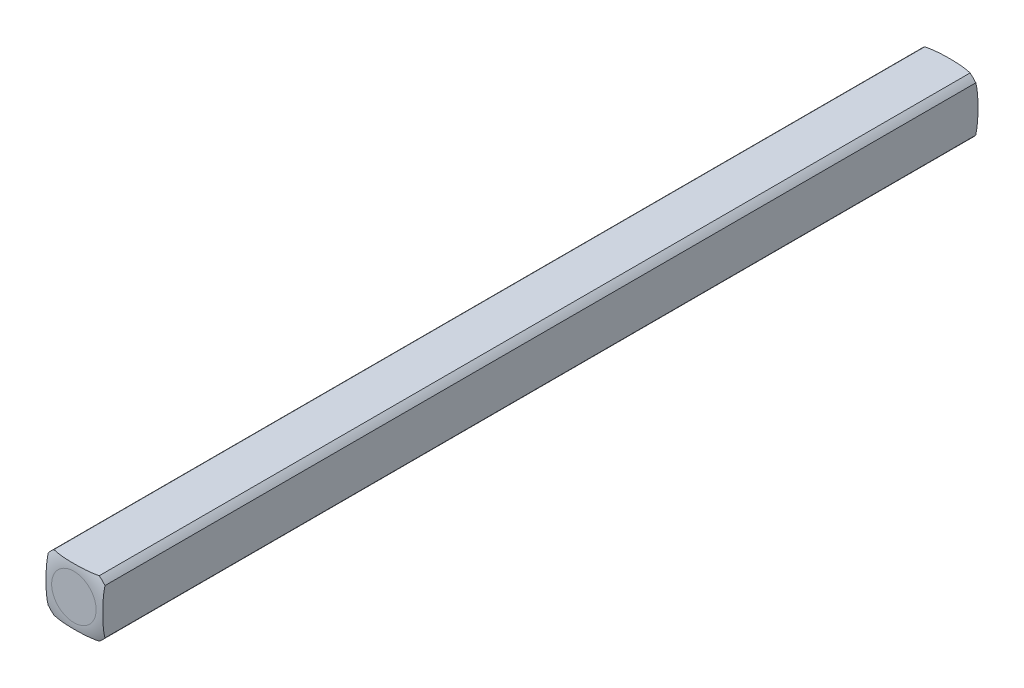
ISO-10303-21;
HEADER;
FILE_DESCRIPTION(('STEP AP214'),'2;1');
FILE_NAME('part.step','',(''),(''),'','','');
FILE_SCHEMA(('AUTOMOTIVE_DESIGN { 1 0 10303 214 1 1 1 1 }'));
ENDSEC;
DATA;
#1=APPLICATION_CONTEXT('core data for automotive mechanical design processes');
#2=APPLICATION_PROTOCOL_DEFINITION('international standard','automotive_design',2000,#1);
#3=PRODUCT_CONTEXT('',#1,'mechanical');
#4=PRODUCT('Part','Part','',(#3));
#5=PRODUCT_RELATED_PRODUCT_CATEGORY('part','',(#4));
#6=PRODUCT_DEFINITION_FORMATION('','',#4);
#7=PRODUCT_DEFINITION_CONTEXT('part definition',#1,'design');
#8=PRODUCT_DEFINITION('design','',#6,#7);
#9=PRODUCT_DEFINITION_SHAPE('','',#8);
#10=(LENGTH_UNIT() NAMED_UNIT(*) SI_UNIT(.MILLI.,.METRE.));
#11=(NAMED_UNIT(*) PLANE_ANGLE_UNIT() SI_UNIT($,.RADIAN.));
#12=(NAMED_UNIT(*) SI_UNIT($,.STERADIAN.) SOLID_ANGLE_UNIT());
#13=UNCERTAINTY_MEASURE_WITH_UNIT(LENGTH_MEASURE(1.E-05),#10,'distance_accuracy_value','');
#14=(GEOMETRIC_REPRESENTATION_CONTEXT(3) GLOBAL_UNCERTAINTY_ASSIGNED_CONTEXT((#13)) GLOBAL_UNIT_ASSIGNED_CONTEXT((#10,
#11,#12)) REPRESENTATION_CONTEXT('',''));
#15=CARTESIAN_POINT('',(0.,0.,0.));
#16=DIRECTION('',(0.,0.,1.));
#17=DIRECTION('',(1.,0.,0.));
#18=AXIS2_PLACEMENT_3D('',#15,#16,#17);
#19=CARTESIAN_POINT('',(-1.5875,1.5875,24.511));
#20=DIRECTION('',(0.,-1.,0.));
#21=DIRECTION('',(0.,0.,-1.));
#22=AXIS2_PLACEMENT_3D('',#19,#20,#21);
#23=PLANE('',#22);
#24=CARTESIAN_POINT('',(-1.26841150657032,1.5875,-24.359919142098));
#25=CARTESIAN_POINT('',(-1.22720105040827,1.5875,-24.3701762604742));
#26=CARTESIAN_POINT('',(-1.18578761357715,1.5875,-24.3795927535058));
#27=CARTESIAN_POINT('',(-1.10271120238515,1.5875,-24.396861071626));
#28=CARTESIAN_POINT('',(-1.06104879805326,1.5875,-24.4047156312751));
#29=CARTESIAN_POINT('',(-0.977511179219671,1.5875,-24.4190074369776));
#30=CARTESIAN_POINT('',(-0.935636116352007,1.5875,-24.42544557827));
#31=CARTESIAN_POINT('',(-0.851956325967505,1.5875,-24.4370202217379));
#32=CARTESIAN_POINT('',(-0.810152608329632,1.5875,-24.4421640837943));
#33=CARTESIAN_POINT('',(-0.726405135779137,1.5875,-24.4513448983346));
#34=CARTESIAN_POINT('',(-0.684461324131018,1.5875,-24.4553813277516));
#35=CARTESIAN_POINT('',(-0.600471089740529,1.5875,-24.4624873965405));
#36=CARTESIAN_POINT('',(-0.558424624783739,1.5875,-24.4655565288188));
#37=CARTESIAN_POINT('',(-0.442316252980674,1.5875,-24.472876819996));
#38=CARTESIAN_POINT('',(-0.368199297688292,1.5875,-24.4762546095867));
#39=CARTESIAN_POINT('',(-0.219899169562809,1.5875,-24.4810241426145));
#40=CARTESIAN_POINT('',(-0.145715990031084,1.5875,-24.4824156550284));
#41=CARTESIAN_POINT('',(0.00261925426797948,1.5875,-24.4835115381934));
#42=CARTESIAN_POINT('',(0.0767713119995158,1.5875,-24.4832168909073));
#43=CARTESIAN_POINT('',(0.225055834270072,1.5875,-24.4808755268396));
#44=CARTESIAN_POINT('',(0.299188296702176,1.5875,-24.4788286662978));
#45=CARTESIAN_POINT('',(0.44849139385932,1.5875,-24.472519272075));
#46=CARTESIAN_POINT('',(0.523660700911135,1.5875,-24.4682235679572));
#47=CARTESIAN_POINT('',(0.673772419103411,1.5875,-24.4567011997426));
#48=CARTESIAN_POINT('',(0.748714874122611,1.5875,-24.4494751445196));
#49=CARTESIAN_POINT('',(0.87329478104068,1.5875,-24.4343054206117));
#50=CARTESIAN_POINT('',(0.923058303404112,1.5875,-24.4273998036191));
#51=CARTESIAN_POINT('',(1.02230885751261,1.5875,-24.4116736221696));
#52=CARTESIAN_POINT('',(1.07179576173137,1.5875,-24.4028522389467));
#53=CARTESIAN_POINT('',(1.17042027552899,1.5875,-24.3830571345187));
#54=CARTESIAN_POINT('',(1.21955717475179,1.58749999999998,-24.372079888906));
#55=CARTESIAN_POINT('',(1.26841150657033,1.58749999999996,-24.359919142098));
#56=B_SPLINE_CURVE_WITH_KNOTS('',3,(#24,#25,#26,#27,#28,#29,#30,#31,#32,#33,#34,#35,#36,#37,#38,
#39,#40,#41,#42,#43,#44,#45,#46,#47,#48,#49,#50,#51,#52,#53,#54,#55),.UNSPECIFIED.,.F.,.F.,(4,2,
2,2,2,2,2,2,2,2,2,2,2,2,2,4),(0.,0.127385669214939,0.254546315061874,0.381626357369298,
0.507966543484054,0.634366300757341,0.760832211740164,0.983375124489356,1.20594391900466,
1.42838311012144,1.65084055299023,1.87667574497211,2.10246403651326,2.25315484465145,
2.40391018266841,2.55491405868559),.UNSPECIFIED.);
#57=CARTESIAN_POINT('',(-1.26841150657032,1.5875,-24.359919142098));
#58=VERTEX_POINT('',#57);
#59=CARTESIAN_POINT('',(1.26841150657032,1.5875,-24.359919142098));
#60=VERTEX_POINT('',#59);
#61=EDGE_CURVE('E111',#58,#60,#56,.T.);
#62=ORIENTED_EDGE('',*,*,#61,.F.);
#63=DIRECTION('',(0.,0.,1.));
#64=VECTOR('',#63,1.);
#65=CARTESIAN_POINT('',(-1.26841150657032,1.5875,-24.511));
#66=LINE('',#65,#64);
#67=CARTESIAN_POINT('',(-1.26841150657032,1.5875,24.359919142098));
#68=VERTEX_POINT('',#67);
#69=EDGE_CURVE('E121',#68,#58,#66,.F.);
#70=ORIENTED_EDGE('',*,*,#69,.F.);
#71=CARTESIAN_POINT('',(1.26841150657032,1.5875,24.359919142098));
#72=CARTESIAN_POINT('',(1.22720105040827,1.5875,24.3701762604742));
#73=CARTESIAN_POINT('',(1.18578761357715,1.5875,24.3795927535058));
#74=CARTESIAN_POINT('',(1.10271120238515,1.5875,24.396861071626));
#75=CARTESIAN_POINT('',(1.06104879805326,1.5875,24.4047156312751));
#76=CARTESIAN_POINT('',(0.977511179219671,1.5875,24.4190074369776));
#77=CARTESIAN_POINT('',(0.935636116352007,1.5875,24.42544557827));
#78=CARTESIAN_POINT('',(0.851956325967506,1.5875,24.4370202217379));
#79=CARTESIAN_POINT('',(0.810152608329632,1.5875,24.4421640837943));
#80=CARTESIAN_POINT('',(0.726405135779138,1.5875,24.4513448983346));
#81=CARTESIAN_POINT('',(0.684461324131018,1.5875,24.4553813277516));
#82=CARTESIAN_POINT('',(0.600471089740529,1.5875,24.4624873965405));
#83=CARTESIAN_POINT('',(0.55842462478374,1.5875,24.4655565288188));
#84=CARTESIAN_POINT('',(0.442316252980675,1.5875,24.472876819996));
#85=CARTESIAN_POINT('',(0.368199297688293,1.5875,24.4762546095867));
#86=CARTESIAN_POINT('',(0.219899169562809,1.5875,24.4810241426145));
#87=CARTESIAN_POINT('',(0.145715990031084,1.5875,24.4824156550284));
#88=CARTESIAN_POINT('',(-0.00261925426797917,1.5875,24.4835115381934));
#89=CARTESIAN_POINT('',(-0.0767713119995154,1.5875,24.4832168909073));
#90=CARTESIAN_POINT('',(-0.225055834270072,1.5875,24.4808755268396));
#91=CARTESIAN_POINT('',(-0.299188296702176,1.5875,24.4788286662978));
#92=CARTESIAN_POINT('',(-0.44849139385932,1.5875,24.472519272075));
#93=CARTESIAN_POINT('',(-0.523660700911135,1.5875,24.4682235679572));
#94=CARTESIAN_POINT('',(-0.673772419103411,1.5875,24.4567011997426));
#95=CARTESIAN_POINT('',(-0.748714874122611,1.5875,24.4494751445196));
#96=CARTESIAN_POINT('',(-0.87329478104068,1.5875,24.4343054206117));
#97=CARTESIAN_POINT('',(-0.923058303404112,1.5875,24.4273998036191));
#98=CARTESIAN_POINT('',(-1.02230885751261,1.5875,24.4116736221696));
#99=CARTESIAN_POINT('',(-1.07179576173137,1.5875,24.4028522389467));
#100=CARTESIAN_POINT('',(-1.17042027552899,1.5875,24.3830571345187));
#101=CARTESIAN_POINT('',(-1.21955717475179,1.58749999999998,24.372079888906));
#102=CARTESIAN_POINT('',(-1.26841150657033,1.58749999999996,24.359919142098));
#103=B_SPLINE_CURVE_WITH_KNOTS('',3,(#71,#72,#73,#74,#75,#76,#77,#78,#79,#80,#81,#82,#83,#84,
#85,#86,#87,#88,#89,#90,#91,#92,#93,#94,#95,#96,#97,#98,#99,#100,#101,#102),.UNSPECIFIED.,.F.,
.F.,(4,2,2,2,2,2,2,2,2,2,2,2,2,2,2,4),(0.,0.127385669214939,0.254546315061873,0.381626357369297,
0.507966543484054,0.63436630075734,0.760832211740163,0.983375124489355,1.20594391900466,
1.42838311012144,1.65084055299023,1.87667574497211,2.10246403651326,2.25315484465145,
2.40391018266841,2.55491405868559),.UNSPECIFIED.);
#104=CARTESIAN_POINT('',(1.26841150657032,1.5875,24.359919142098));
#105=VERTEX_POINT('',#104);
#106=EDGE_CURVE('E87',#105,#68,#103,.T.);
#107=ORIENTED_EDGE('',*,*,#106,.F.);
#108=DIRECTION('',(0.,0.,1.));
#109=VECTOR('',#108,1.);
#110=CARTESIAN_POINT('',(1.26841150657032,1.5875,-24.511));
#111=LINE('',#110,#109);
#112=EDGE_CURVE('E110',#60,#105,#111,.T.);
#113=ORIENTED_EDGE('',*,*,#112,.F.);
#114=EDGE_LOOP('',(#62,#70,#107,#113));
#115=FACE_BOUND('',#114,.T.);
#116=ADVANCED_FACE('F16',(#115),#23,.F.);
#117=CARTESIAN_POINT('',(0.,0.,-24.511));
#118=DIRECTION('',(0.,0.,1.));
#119=DIRECTION('',(1.,0.,0.));
#120=AXIS2_PLACEMENT_3D('',#117,#118,#119);
#121=CYLINDRICAL_SURFACE('',#120,2.032);
#122=CARTESIAN_POINT('',(0.,0.,24.359919142098));
#123=DIRECTION('',(0.,0.,1.));
#124=DIRECTION('',(1.,0.,0.));
#125=AXIS2_PLACEMENT_3D('',#122,#123,#124);
#126=CIRCLE('',#125,2.032);
#127=CARTESIAN_POINT('',(1.5875,1.26841150657032,24.359919142098));
#128=VERTEX_POINT('',#127);
#129=EDGE_CURVE('E95',#105,#128,#126,.F.);
#130=ORIENTED_EDGE('',*,*,#129,.T.);
#131=DIRECTION('',(0.,0.,1.));
#132=VECTOR('',#131,1.);
#133=CARTESIAN_POINT('',(1.5875,1.26841150657032,24.511));
#134=LINE('',#133,#132);
#135=CARTESIAN_POINT('',(1.5875,1.26841150657032,-24.359919142098));
#136=VERTEX_POINT('',#135);
#137=EDGE_CURVE('E108',#128,#136,#134,.F.);
#138=ORIENTED_EDGE('',*,*,#137,.T.);
#139=CARTESIAN_POINT('',(0.,0.,-24.359919142098));
#140=DIRECTION('',(0.,0.,1.));
#141=DIRECTION('',(1.,0.,0.));
#142=AXIS2_PLACEMENT_3D('',#139,#140,#141);
#143=CIRCLE('',#142,2.032);
#144=EDGE_CURVE('E279',#60,#136,#143,.F.);
#145=ORIENTED_EDGE('',*,*,#144,.F.);
#146=ORIENTED_EDGE('',*,*,#112,.T.);
#147=EDGE_LOOP('',(#130,#138,#145,#146));
#148=FACE_BOUND('',#147,.T.);
#149=ADVANCED_FACE('F106',(#148),#121,.T.);
#150=CARTESIAN_POINT('',(0.,0.,-24.511));
#151=DIRECTION('',(0.,0.,1.));
#152=DIRECTION('',(1.,0.,0.));
#153=AXIS2_PLACEMENT_3D('',#150,#151,#152);
#154=CYLINDRICAL_SURFACE('',#153,2.032);
#155=CARTESIAN_POINT('',(0.,0.,24.359919142098));
#156=DIRECTION('',(0.,0.,1.));
#157=DIRECTION('',(1.,0.,0.));
#158=AXIS2_PLACEMENT_3D('',#155,#156,#157);
#159=CIRCLE('',#158,2.032);
#160=CARTESIAN_POINT('',(-1.5875,1.26841150657032,24.359919142098));
#161=VERTEX_POINT('',#160);
#162=EDGE_CURVE('E278',#161,#68,#159,.F.);
#163=ORIENTED_EDGE('',*,*,#162,.T.);
#164=ORIENTED_EDGE('',*,*,#69,.T.);
#165=CARTESIAN_POINT('',(0.,0.,-24.359919142098));
#166=DIRECTION('',(0.,0.,1.));
#167=DIRECTION('',(1.,0.,0.));
#168=AXIS2_PLACEMENT_3D('',#165,#166,#167);
#169=CIRCLE('',#168,2.032);
#170=CARTESIAN_POINT('',(-1.5875,1.26841150657032,-24.359919142098));
#171=VERTEX_POINT('',#170);
#172=EDGE_CURVE('E167',#58,#171,#169,.T.);
#173=ORIENTED_EDGE('',*,*,#172,.T.);
#174=DIRECTION('',(0.,0.,-1.));
#175=VECTOR('',#174,1.);
#176=CARTESIAN_POINT('',(-1.5875,1.26841150657032,24.511));
#177=LINE('',#176,#175);
#178=EDGE_CURVE('E189',#171,#161,#177,.F.);
#179=ORIENTED_EDGE('',*,*,#178,.T.);
#180=EDGE_LOOP('',(#163,#164,#173,#179));
#181=FACE_BOUND('',#180,.T.);
#182=ADVANCED_FACE('F149',(#181),#154,.T.);
#183=CARTESIAN_POINT('',(-1.5875,1.5875,24.511));
#184=DIRECTION('',(0.,0.,-1.));
#185=DIRECTION('',(-1.,0.,0.));
#186=AXIS2_PLACEMENT_3D('',#183,#184,#185);
#187=PLANE('',#186);
#188=CARTESIAN_POINT('',(0.,0.,24.511));
#189=DIRECTION('',(0.,0.,-1.));
#190=DIRECTION('',(1.,0.,0.));
#191=AXIS2_PLACEMENT_3D('',#188,#189,#190);
#192=CIRCLE('',#191,1.24506403026729);
#193=CARTESIAN_POINT('',(1.24506403026729,0.,24.511));
#194=VERTEX_POINT('',#193);
#195=CARTESIAN_POINT('',(-1.24506403026729,0.,24.511));
#196=VERTEX_POINT('',#195);
#197=EDGE_CURVE('E133',#194,#196,#192,.T.);
#198=ORIENTED_EDGE('',*,*,#197,.F.);
#199=CARTESIAN_POINT('',(0.,0.,24.511));
#200=DIRECTION('',(0.,0.,-1.));
#201=DIRECTION('',(-1.,0.,0.));
#202=AXIS2_PLACEMENT_3D('',#199,#200,#201);
#203=CIRCLE('',#202,1.24506403026729);
#204=EDGE_CURVE('E116',#196,#194,#203,.T.);
#205=ORIENTED_EDGE('',*,*,#204,.F.);
#206=EDGE_LOOP('',(#198,#205));
#207=FACE_BOUND('',#206,.T.);
#208=ADVANCED_FACE('F139',(#207),#187,.F.);
#209=CARTESIAN_POINT('',(1.5875,-1.5875,24.511));
#210=DIRECTION('',(-1.,0.,0.));
#211=DIRECTION('',(0.,0.,1.));
#212=AXIS2_PLACEMENT_3D('',#209,#210,#211);
#213=PLANE('',#212);
#214=CARTESIAN_POINT('',(1.5875,1.26841150657032,-24.359919142098));
#215=CARTESIAN_POINT('',(1.5875,1.14493309030411,-24.3906460633221));
#216=CARTESIAN_POINT('',(1.5875,1.01998399304385,-24.4137556661494));
#217=CARTESIAN_POINT('',(1.5875,0.768859486803964,-24.4485369425311));
#218=CARTESIAN_POINT('',(1.5875,0.642689416140679,-24.460245727962));
#219=CARTESIAN_POINT('',(1.5875,0.430424575859672,-24.4736252995166));
#220=CARTESIAN_POINT('',(1.5875,0.344419790998953,-24.4773089066951));
#221=CARTESIAN_POINT('',(1.5875,0.172275750609277,-24.4821119883047));
#222=CARTESIAN_POINT('',(1.5875,0.0861364440860133,-24.4832298028463));
#223=CARTESIAN_POINT('',(1.5875,-0.0708815141524198,-24.4832253528724));
#224=CARTESIAN_POINT('',(1.5875,-0.141761089973269,-24.4824647503116));
#225=CARTESIAN_POINT('',(1.5875,-0.283443517066234,-24.4792632283593));
#226=CARTESIAN_POINT('',(1.5875,-0.354246388904853,-24.4768233071219));
#227=CARTESIAN_POINT('',(1.5875,-0.495806846039994,-24.4698353290476));
#228=CARTESIAN_POINT('',(1.5875,-0.566564357181163,-24.4652856874328));
#229=CARTESIAN_POINT('',(1.5875,-0.707839358368326,-24.4534687398624));
#230=CARTESIAN_POINT('',(1.5875,-0.778356910390612,-24.4462021995254));
#231=CARTESIAN_POINT('',(1.5875,-0.919223859265381,-24.4282291029893));
#232=CARTESIAN_POINT('',(1.5875,-0.989571770847698,-24.4175104282261));
#233=CARTESIAN_POINT('',(1.5875,-1.12959917493506,-24.3919650360794));
#234=CARTESIAN_POINT('',(1.5875,-1.19927774910522,-24.3771333317905));
#235=CARTESIAN_POINT('',(1.5875,-1.26841150657033,-24.359919142098));
#236=B_SPLINE_CURVE_WITH_KNOTS('',3,(#214,#215,#216,#217,#218,#219,#220,#221,#222,#223,#224,
#225,#226,#227,#228,#229,#230,#231,#232,#233,#234,#235),.UNSPECIFIED.,.F.,.F.,(4,2,2,2,2,2,2,2,
2,2,4),(0.,0.380919121752864,0.76059409064773,1.01882661939084,1.27722615960104,
1.48986264420096,1.70237285085079,1.91504294996344,2.12765316402353,2.34101802413352,
2.55464272138866),.UNSPECIFIED.);
#237=CARTESIAN_POINT('',(1.5875,-1.26841150657032,-24.359919142098));
#238=VERTEX_POINT('',#237);
#239=EDGE_CURVE('E114',#136,#238,#236,.T.);
#240=ORIENTED_EDGE('',*,*,#239,.F.);
#241=ORIENTED_EDGE('',*,*,#137,.F.);
#242=CARTESIAN_POINT('',(1.5875,-1.26841150657032,24.359919142098));
#243=CARTESIAN_POINT('',(1.5875,-1.14493309030411,24.3906460633221));
#244=CARTESIAN_POINT('',(1.5875,-1.01998399304385,24.4137556661494));
#245=CARTESIAN_POINT('',(1.5875,-0.768859486803965,24.4485369425311));
#246=CARTESIAN_POINT('',(1.5875,-0.64268941614068,24.460245727962));
#247=CARTESIAN_POINT('',(1.5875,-0.430424575859672,24.4736252995166));
#248=CARTESIAN_POINT('',(1.5875,-0.344419790998954,24.4773089066951));
#249=CARTESIAN_POINT('',(1.5875,-0.172275750609278,24.4821119883047));
#250=CARTESIAN_POINT('',(1.5875,-0.0861364440860133,24.4832298028463));
#251=CARTESIAN_POINT('',(1.5875,0.0708815141524199,24.4832253528724));
#252=CARTESIAN_POINT('',(1.5875,0.141761089973269,24.4824647503116));
#253=CARTESIAN_POINT('',(1.5875,0.283443517066234,24.4792632283593));
#254=CARTESIAN_POINT('',(1.5875,0.354246388904853,24.4768233071219));
#255=CARTESIAN_POINT('',(1.5875,0.495806846039994,24.4698353290476));
#256=CARTESIAN_POINT('',(1.5875,0.566564357181162,24.4652856874328));
#257=CARTESIAN_POINT('',(1.5875,0.707839358368325,24.4534687398624));
#258=CARTESIAN_POINT('',(1.5875,0.77835691039061,24.4462021995254));
#259=CARTESIAN_POINT('',(1.5875,0.91922385926538,24.4282291029893));
#260=CARTESIAN_POINT('',(1.5875,0.989571770847696,24.4175104282261));
#261=CARTESIAN_POINT('',(1.5875,1.12959917493505,24.3919650360794));
#262=CARTESIAN_POINT('',(1.5875,1.19927774910522,24.3771333317905));
#263=CARTESIAN_POINT('',(1.5875,1.26841150657032,24.359919142098));
#264=B_SPLINE_CURVE_WITH_KNOTS('',3,(#242,#243,#244,#245,#246,#247,#248,#249,#250,#251,#252,
#253,#254,#255,#256,#257,#258,#259,#260,#261,#262,#263),.UNSPECIFIED.,.F.,.F.,(4,2,2,2,2,2,2,2,
2,2,4),(0.,0.380919121752864,0.76059409064773,1.01882661939084,1.27722615960104,
1.48986264420096,1.70237285085079,1.91504294996344,2.12765316402353,2.34101802413352,
2.55464272138866),.UNSPECIFIED.);
#265=CARTESIAN_POINT('',(1.5875,-1.26841150657032,24.359919142098));
#266=VERTEX_POINT('',#265);
#267=EDGE_CURVE('E92',#266,#128,#264,.T.);
#268=ORIENTED_EDGE('',*,*,#267,.F.);
#269=DIRECTION('',(0.,0.,1.));
#270=VECTOR('',#269,1.);
#271=CARTESIAN_POINT('',(1.5875,-1.26841150657032,-24.511));
#272=LINE('',#271,#270);
#273=EDGE_CURVE('E101',#238,#266,#272,.T.);
#274=ORIENTED_EDGE('',*,*,#273,.F.);
#275=EDGE_LOOP('',(#240,#241,#268,#274));
#276=FACE_BOUND('',#275,.T.);
#277=ADVANCED_FACE('F113',(#276),#213,.F.);
#278=CARTESIAN_POINT('',(-1.5875,1.5875,-24.511));
#279=DIRECTION('',(0.,0.,-1.));
#280=DIRECTION('',(-1.,0.,0.));
#281=AXIS2_PLACEMENT_3D('',#278,#279,#280);
#282=PLANE('',#281);
#283=CARTESIAN_POINT('',(0.,0.,-24.511));
#284=DIRECTION('',(0.,0.,1.));
#285=DIRECTION('',(1.,0.,0.));
#286=AXIS2_PLACEMENT_3D('',#283,#284,#285);
#287=CIRCLE('',#286,1.24506403026729);
#288=CARTESIAN_POINT('',(-1.24506403026729,0.,-24.511));
#289=VERTEX_POINT('',#288);
#290=CARTESIAN_POINT('',(1.24506403026729,0.,-24.511));
#291=VERTEX_POINT('',#290);
#292=EDGE_CURVE('E118',#289,#291,#287,.F.);
#293=ORIENTED_EDGE('',*,*,#292,.T.);
#294=CARTESIAN_POINT('',(0.,0.,-24.511));
#295=DIRECTION('',(0.,0.,1.));
#296=DIRECTION('',(-1.,0.,0.));
#297=AXIS2_PLACEMENT_3D('',#294,#295,#296);
#298=CIRCLE('',#297,1.24506403026729);
#299=EDGE_CURVE('E224',#289,#291,#298,.T.);
#300=ORIENTED_EDGE('',*,*,#299,.F.);
#301=EDGE_LOOP('',(#293,#300));
#302=FACE_BOUND('',#301,.T.);
#303=ADVANCED_FACE('F207',(#302),#282,.T.);
#304=CARTESIAN_POINT('',(-1.5875,-1.5875,24.511));
#305=DIRECTION('',(1.,0.,0.));
#306=DIRECTION('',(0.,0.,-1.));
#307=AXIS2_PLACEMENT_3D('',#304,#305,#306);
#308=PLANE('',#307);
#309=ORIENTED_EDGE('',*,*,#178,.F.);
#310=CARTESIAN_POINT('',(-1.5875,-1.26841150657032,-24.359919142098));
#311=CARTESIAN_POINT('',(-1.5875,-1.14493309030411,-24.3906460633221));
#312=CARTESIAN_POINT('',(-1.5875,-1.01998399304386,-24.4137556661494));
#313=CARTESIAN_POINT('',(-1.5875,-0.768859486803972,-24.4485369425311));
#314=CARTESIAN_POINT('',(-1.5875,-0.642689416140689,-24.460245727962));
#315=CARTESIAN_POINT('',(-1.5875,-0.430424575859681,-24.4736252995166));
#316=CARTESIAN_POINT('',(-1.5875,-0.344419790998961,-24.4773089066951));
#317=CARTESIAN_POINT('',(-1.5875,-0.172275750609281,-24.4821119883047));
#318=CARTESIAN_POINT('',(-1.5875,-0.086136444086015,-24.4832298028463));
#319=CARTESIAN_POINT('',(-1.5875,0.07088151415242,-24.4832253528724));
#320=CARTESIAN_POINT('',(-1.5875,0.141761089973269,-24.4824647503116));
#321=CARTESIAN_POINT('',(-1.5875,0.283443517066234,-24.4792632283593));
#322=CARTESIAN_POINT('',(-1.5875,0.354246388904853,-24.4768233071219));
#323=CARTESIAN_POINT('',(-1.5875,0.495806846039994,-24.4698353290476));
#324=CARTESIAN_POINT('',(-1.5875,0.566564357181163,-24.4652856874328));
#325=CARTESIAN_POINT('',(-1.5875,0.707839358368326,-24.4534687398624));
#326=CARTESIAN_POINT('',(-1.5875,0.778356910390611,-24.4462021995254));
#327=CARTESIAN_POINT('',(-1.5875,0.919223859265381,-24.4282291029893));
#328=CARTESIAN_POINT('',(-1.5875,0.989571770847697,-24.4175104282261));
#329=CARTESIAN_POINT('',(-1.5875,1.12959917493505,-24.3919650360794));
#330=CARTESIAN_POINT('',(-1.5875,1.19927774910522,-24.3771333317905));
#331=CARTESIAN_POINT('',(-1.5875,1.26841150657032,-24.359919142098));
#332=B_SPLINE_CURVE_WITH_KNOTS('',3,(#310,#311,#312,#313,#314,#315,#316,#317,#318,#319,#320,
#321,#322,#323,#324,#325,#326,#327,#328,#329,#330,#331),.UNSPECIFIED.,.F.,.F.,(4,2,2,2,2,2,2,2,
2,2,4),(0.,0.380919121752859,0.760594090647719,1.01882661939083,1.27722615960104,
1.48986264420096,1.70237285085079,1.91504294996344,2.12765316402353,2.34101802413352,
2.55464272138866),.UNSPECIFIED.);
#333=CARTESIAN_POINT('',(-1.5875,-1.26841150657032,-24.359919142098));
#334=VERTEX_POINT('',#333);
#335=EDGE_CURVE('E229',#334,#171,#332,.T.);
#336=ORIENTED_EDGE('',*,*,#335,.F.);
#337=DIRECTION('',(0.,0.,1.));
#338=VECTOR('',#337,1.);
#339=CARTESIAN_POINT('',(-1.5875,-1.26841150657032,-24.511));
#340=LINE('',#339,#338);
#341=CARTESIAN_POINT('',(-1.5875,-1.26841150657032,24.359919142098));
#342=VERTEX_POINT('',#341);
#343=EDGE_CURVE('E192',#342,#334,#340,.F.);
#344=ORIENTED_EDGE('',*,*,#343,.F.);
#345=CARTESIAN_POINT('',(-1.5875,1.26841150657032,24.359919142098));
#346=CARTESIAN_POINT('',(-1.5875,1.14493309030411,24.3906460633221));
#347=CARTESIAN_POINT('',(-1.5875,1.01998399304385,24.4137556661494));
#348=CARTESIAN_POINT('',(-1.5875,0.768859486803965,24.4485369425311));
#349=CARTESIAN_POINT('',(-1.5875,0.64268941614068,24.460245727962));
#350=CARTESIAN_POINT('',(-1.5875,0.430424575859672,24.4736252995166));
#351=CARTESIAN_POINT('',(-1.5875,0.344419790998953,24.4773089066951));
#352=CARTESIAN_POINT('',(-1.5875,0.172275750609277,24.4821119883047));
#353=CARTESIAN_POINT('',(-1.5875,0.0861364440860132,24.4832298028463));
#354=CARTESIAN_POINT('',(-1.5875,-0.07088151415242,24.4832253528724));
#355=CARTESIAN_POINT('',(-1.5875,-0.141761089973269,24.4824647503116));
#356=CARTESIAN_POINT('',(-1.5875,-0.283443517066234,24.4792632283593));
#357=CARTESIAN_POINT('',(-1.5875,-0.354246388904853,24.4768233071219));
#358=CARTESIAN_POINT('',(-1.5875,-0.495806846039994,24.4698353290476));
#359=CARTESIAN_POINT('',(-1.5875,-0.566564357181163,24.4652856874328));
#360=CARTESIAN_POINT('',(-1.5875,-0.707839358368325,24.4534687398624));
#361=CARTESIAN_POINT('',(-1.5875,-0.778356910390611,24.4462021995254));
#362=CARTESIAN_POINT('',(-1.5875,-0.919223859265381,24.4282291029893));
#363=CARTESIAN_POINT('',(-1.5875,-0.989571770847697,24.4175104282261));
#364=CARTESIAN_POINT('',(-1.5875,-1.12959917493505,24.3919650360794));
#365=CARTESIAN_POINT('',(-1.5875,-1.19927774910522,24.3771333317905));
#366=CARTESIAN_POINT('',(-1.5875,-1.26841150657032,24.359919142098));
#367=B_SPLINE_CURVE_WITH_KNOTS('',3,(#345,#346,#347,#348,#349,#350,#351,#352,#353,#354,#355,
#356,#357,#358,#359,#360,#361,#362,#363,#364,#365,#366),.UNSPECIFIED.,.F.,.F.,(4,2,2,2,2,2,2,2,
2,2,4),(0.,0.380919121752864,0.76059409064773,1.01882661939084,1.27722615960104,
1.48986264420096,1.70237285085079,1.91504294996344,2.12765316402353,2.34101802413352,
2.55464272138866),.UNSPECIFIED.);
#368=EDGE_CURVE('E102',#161,#342,#367,.T.);
#369=ORIENTED_EDGE('',*,*,#368,.F.);
#370=EDGE_LOOP('',(#309,#336,#344,#369));
#371=FACE_BOUND('',#370,.T.);
#372=ADVANCED_FACE('F180',(#371),#308,.F.);
#373=CARTESIAN_POINT('',(1.24506403026729,0.,22.386));
#374=DIRECTION('',(0.,-1.,0.));
#375=DIRECTION('',(1.,0.,0.));
#376=AXIS2_PLACEMENT_3D('',#373,#374,#375);
#377=CIRCLE('',#376,2.125);
#378=TRIMMED_CURVE('',#377,(PARAMETER_VALUE(-2.19680193092879)),
(PARAMETER_VALUE(2.19680193092879)),.T.,.PARAMETER.);
#379=CARTESIAN_POINT('',(0.,0.,22.386));
#380=DIRECTION('',(0.,0.,-1.));
#381=AXIS1_PLACEMENT('',#379,#380);
#382=SURFACE_OF_REVOLUTION('',#378,#381);
#383=ORIENTED_EDGE('',*,*,#197,.T.);
#384=ORIENTED_EDGE('',*,*,#204,.T.);
#385=EDGE_LOOP('',(#383,#384));
#386=FACE_BOUND('',#385,.T.);
#387=ORIENTED_EDGE('',*,*,#267,.T.);
#388=ORIENTED_EDGE('',*,*,#129,.F.);
#389=ORIENTED_EDGE('',*,*,#106,.T.);
#390=ORIENTED_EDGE('',*,*,#162,.F.);
#391=ORIENTED_EDGE('',*,*,#368,.T.);
#392=CARTESIAN_POINT('',(0.,0.,24.359919142098));
#393=DIRECTION('',(0.,0.,1.));
#394=DIRECTION('',(1.,0.,0.));
#395=AXIS2_PLACEMENT_3D('',#392,#393,#394);
#396=CIRCLE('',#395,2.032);
#397=CARTESIAN_POINT('',(-1.26841150657032,-1.5875,24.359919142098));
#398=VERTEX_POINT('',#397);
#399=EDGE_CURVE('E195',#398,#342,#396,.F.);
#400=ORIENTED_EDGE('',*,*,#399,.F.);
#401=CARTESIAN_POINT('',(-1.26841150657032,-1.5875,24.359919142098));
#402=CARTESIAN_POINT('',(-1.22720105040827,-1.5875,24.3701762604742));
#403=CARTESIAN_POINT('',(-1.18578761357715,-1.5875,24.3795927535058));
#404=CARTESIAN_POINT('',(-1.10271120238515,-1.5875,24.396861071626));
#405=CARTESIAN_POINT('',(-1.06104879805326,-1.5875,24.4047156312751));
#406=CARTESIAN_POINT('',(-0.977511179219671,-1.5875,24.4190074369776));
#407=CARTESIAN_POINT('',(-0.935636116352007,-1.5875,24.42544557827));
#408=CARTESIAN_POINT('',(-0.851956325967506,-1.5875,24.4370202217379));
#409=CARTESIAN_POINT('',(-0.810152608329633,-1.5875,24.4421640837943));
#410=CARTESIAN_POINT('',(-0.726405135779138,-1.5875,24.4513448983346));
#411=CARTESIAN_POINT('',(-0.684461324131018,-1.5875,24.4553813277516));
#412=CARTESIAN_POINT('',(-0.600471089740529,-1.5875,24.4624873965405));
#413=CARTESIAN_POINT('',(-0.55842462478374,-1.5875,24.4655565288188));
#414=CARTESIAN_POINT('',(-0.442316252980675,-1.5875,24.472876819996));
#415=CARTESIAN_POINT('',(-0.368199297688293,-1.5875,24.4762546095867));
#416=CARTESIAN_POINT('',(-0.219899169562809,-1.5875,24.4810241426145));
#417=CARTESIAN_POINT('',(-0.145715990031084,-1.5875,24.4824156550284));
#418=CARTESIAN_POINT('',(0.0026192542679791,-1.5875,24.4835115381934));
#419=CARTESIAN_POINT('',(0.0767713119995154,-1.5875,24.4832168909073));
#420=CARTESIAN_POINT('',(0.225055834270072,-1.5875,24.4808755268396));
#421=CARTESIAN_POINT('',(0.299188296702176,-1.5875,24.4788286662978));
#422=CARTESIAN_POINT('',(0.44849139385932,-1.5875,24.472519272075));
#423=CARTESIAN_POINT('',(0.523660700911135,-1.5875,24.4682235679572));
#424=CARTESIAN_POINT('',(0.67377241910341,-1.5875,24.4567011997426));
#425=CARTESIAN_POINT('',(0.748714874122611,-1.5875,24.4494751445196));
#426=CARTESIAN_POINT('',(0.87329478104068,-1.5875,24.4343054206117));
#427=CARTESIAN_POINT('',(0.923058303404112,-1.5875,24.4273998036191));
#428=CARTESIAN_POINT('',(1.02230885751261,-1.5875,24.4116736221696));
#429=CARTESIAN_POINT('',(1.07179576173137,-1.5875,24.4028522389467));
#430=CARTESIAN_POINT('',(1.17042027552899,-1.5875,24.3830571345187));
#431=CARTESIAN_POINT('',(1.21955717475179,-1.58749999999998,24.372079888906));
#432=CARTESIAN_POINT('',(1.26841150657033,-1.58749999999996,24.359919142098));
#433=B_SPLINE_CURVE_WITH_KNOTS('',3,(#401,#402,#403,#404,#405,#406,#407,#408,#409,#410,#411,
#412,#413,#414,#415,#416,#417,#418,#419,#420,#421,#422,#423,#424,#425,#426,#427,#428,#429,#430,
#431,#432),.UNSPECIFIED.,.F.,.F.,(4,2,2,2,2,2,2,2,2,2,2,2,2,2,2,4),(0.,0.127385669214939,
0.254546315061874,0.381626357369297,0.507966543484054,0.63436630075734,0.760832211740164,
0.983375124489356,1.20594391900466,1.42838311012144,1.65084055299023,1.87667574497211,
2.10246403651326,2.25315484465145,2.40391018266841,2.55491405868559),.UNSPECIFIED.);
#434=CARTESIAN_POINT('',(1.26841150657032,-1.5875,24.359919142098));
#435=VERTEX_POINT('',#434);
#436=EDGE_CURVE('E194',#398,#435,#433,.T.);
#437=ORIENTED_EDGE('',*,*,#436,.T.);
#438=CARTESIAN_POINT('',(0.,0.,24.359919142098));
#439=DIRECTION('',(0.,0.,1.));
#440=DIRECTION('',(1.,0.,0.));
#441=AXIS2_PLACEMENT_3D('',#438,#439,#440);
#442=CIRCLE('',#441,2.032);
#443=EDGE_CURVE('E97',#266,#435,#442,.F.);
#444=ORIENTED_EDGE('',*,*,#443,.F.);
#445=EDGE_LOOP('',(#387,#388,#389,#390,#391,#400,#437,#444));
#446=FACE_BOUND('',#445,.T.);
#447=ADVANCED_FACE('F94',(#386,#446),#382,.F.);
#448=CARTESIAN_POINT('',(0.,0.,-24.511));
#449=DIRECTION('',(0.,0.,1.));
#450=DIRECTION('',(1.,0.,0.));
#451=AXIS2_PLACEMENT_3D('',#448,#449,#450);
#452=CYLINDRICAL_SURFACE('',#451,2.032);
#453=ORIENTED_EDGE('',*,*,#443,.T.);
#454=DIRECTION('',(0.,0.,1.));
#455=VECTOR('',#454,1.);
#456=CARTESIAN_POINT('',(1.26841150657032,-1.5875,24.511));
#457=LINE('',#456,#455);
#458=CARTESIAN_POINT('',(1.26841150657032,-1.5875,-24.359919142098));
#459=VERTEX_POINT('',#458);
#460=EDGE_CURVE('E234',#435,#459,#457,.F.);
#461=ORIENTED_EDGE('',*,*,#460,.T.);
#462=CARTESIAN_POINT('',(0.,0.,-24.359919142098));
#463=DIRECTION('',(0.,0.,1.));
#464=DIRECTION('',(1.,0.,0.));
#465=AXIS2_PLACEMENT_3D('',#462,#463,#464);
#466=CIRCLE('',#465,2.032);
#467=EDGE_CURVE('E228',#238,#459,#466,.F.);
#468=ORIENTED_EDGE('',*,*,#467,.F.);
#469=ORIENTED_EDGE('',*,*,#273,.T.);
#470=EDGE_LOOP('',(#453,#461,#468,#469));
#471=FACE_BOUND('',#470,.T.);
#472=ADVANCED_FACE('F179',(#471),#452,.T.);
#473=CARTESIAN_POINT('',(1.24506403026729,0.,-22.386));
#474=DIRECTION('',(0.,1.,0.));
#475=DIRECTION('',(1.,0.,0.));
#476=AXIS2_PLACEMENT_3D('',#473,#474,#475);
#477=CIRCLE('',#476,2.125);
#478=TRIMMED_CURVE('',#477,(PARAMETER_VALUE(-2.19680193092879)),
(PARAMETER_VALUE(2.19680193092879)),.T.,.PARAMETER.);
#479=CARTESIAN_POINT('',(0.,0.,-22.386));
#480=DIRECTION('',(0.,0.,1.));
#481=AXIS1_PLACEMENT('',#479,#480);
#482=SURFACE_OF_REVOLUTION('',#478,#481);
#483=ORIENTED_EDGE('',*,*,#335,.T.);
#484=ORIENTED_EDGE('',*,*,#172,.F.);
#485=ORIENTED_EDGE('',*,*,#61,.T.);
#486=ORIENTED_EDGE('',*,*,#144,.T.);
#487=ORIENTED_EDGE('',*,*,#239,.T.);
#488=ORIENTED_EDGE('',*,*,#467,.T.);
#489=CARTESIAN_POINT('',(1.26841150657032,-1.5875,-24.359919142098));
#490=CARTESIAN_POINT('',(1.22720105040827,-1.5875,-24.3701762604742));
#491=CARTESIAN_POINT('',(1.18578761357715,-1.5875,-24.3795927535058));
#492=CARTESIAN_POINT('',(1.10271120238515,-1.5875,-24.396861071626));
#493=CARTESIAN_POINT('',(1.06104879805326,-1.5875,-24.4047156312751));
#494=CARTESIAN_POINT('',(0.977511179219671,-1.5875,-24.4190074369776));
#495=CARTESIAN_POINT('',(0.935636116352007,-1.5875,-24.42544557827));
#496=CARTESIAN_POINT('',(0.851956325967506,-1.5875,-24.4370202217379));
#497=CARTESIAN_POINT('',(0.810152608329632,-1.5875,-24.4421640837943));
#498=CARTESIAN_POINT('',(0.726405135779138,-1.5875,-24.4513448983346));
#499=CARTESIAN_POINT('',(0.684461324131018,-1.5875,-24.4553813277516));
#500=CARTESIAN_POINT('',(0.600471089740529,-1.5875,-24.4624873965405));
#501=CARTESIAN_POINT('',(0.55842462478374,-1.5875,-24.4655565288188));
#502=CARTESIAN_POINT('',(0.442316252980675,-1.5875,-24.472876819996));
#503=CARTESIAN_POINT('',(0.368199297688293,-1.5875,-24.4762546095867));
#504=CARTESIAN_POINT('',(0.219899169562809,-1.5875,-24.4810241426145));
#505=CARTESIAN_POINT('',(0.145715990031084,-1.5875,-24.4824156550284));
#506=CARTESIAN_POINT('',(-0.00261925426797917,-1.5875,-24.4835115381934));
#507=CARTESIAN_POINT('',(-0.0767713119995154,-1.5875,-24.4832168909073));
#508=CARTESIAN_POINT('',(-0.225055834270072,-1.5875,-24.4808755268396));
#509=CARTESIAN_POINT('',(-0.299188296702176,-1.5875,-24.4788286662978));
#510=CARTESIAN_POINT('',(-0.44849139385932,-1.5875,-24.472519272075));
#511=CARTESIAN_POINT('',(-0.523660700911135,-1.5875,-24.4682235679572));
#512=CARTESIAN_POINT('',(-0.673772419103411,-1.5875,-24.4567011997426));
#513=CARTESIAN_POINT('',(-0.748714874122611,-1.5875,-24.4494751445196));
#514=CARTESIAN_POINT('',(-0.87329478104068,-1.5875,-24.4343054206117));
#515=CARTESIAN_POINT('',(-0.923058303404112,-1.5875,-24.4273998036191));
#516=CARTESIAN_POINT('',(-1.02230885751261,-1.5875,-24.4116736221696));
#517=CARTESIAN_POINT('',(-1.07179576173137,-1.5875,-24.4028522389467));
#518=CARTESIAN_POINT('',(-1.17042027552899,-1.5875,-24.3830571345187));
#519=CARTESIAN_POINT('',(-1.21955717475179,-1.58749999999998,-24.372079888906));
#520=CARTESIAN_POINT('',(-1.26841150657033,-1.58749999999996,-24.359919142098));
#521=B_SPLINE_CURVE_WITH_KNOTS('',3,(#489,#490,#491,#492,#493,#494,#495,#496,#497,#498,#499,
#500,#501,#502,#503,#504,#505,#506,#507,#508,#509,#510,#511,#512,#513,#514,#515,#516,#517,#518,
#519,#520),.UNSPECIFIED.,.F.,.F.,(4,2,2,2,2,2,2,2,2,2,2,2,2,2,2,4),(0.,0.127385669214939,
0.254546315061873,0.381626357369297,0.507966543484054,0.63436630075734,0.760832211740163,
0.983375124489355,1.20594391900466,1.42838311012144,1.65084055299023,1.87667574497211,
2.10246403651326,2.25315484465145,2.40391018266841,2.55491405868559),.UNSPECIFIED.);
#522=CARTESIAN_POINT('',(-1.26841150657032,-1.5875,-24.359919142098));
#523=VERTEX_POINT('',#522);
#524=EDGE_CURVE('E28',#459,#523,#521,.T.);
#525=ORIENTED_EDGE('',*,*,#524,.T.);
#526=CARTESIAN_POINT('',(0.,0.,-24.359919142098));
#527=DIRECTION('',(0.,0.,1.));
#528=DIRECTION('',(1.,0.,0.));
#529=AXIS2_PLACEMENT_3D('',#526,#527,#528);
#530=CIRCLE('',#529,2.032);
#531=EDGE_CURVE('E36',#334,#523,#530,.T.);
#532=ORIENTED_EDGE('',*,*,#531,.F.);
#533=EDGE_LOOP('',(#483,#484,#485,#486,#487,#488,#525,#532));
#534=FACE_BOUND('',#533,.T.);
#535=ORIENTED_EDGE('',*,*,#292,.F.);
#536=ORIENTED_EDGE('',*,*,#299,.T.);
#537=EDGE_LOOP('',(#535,#536));
#538=FACE_BOUND('',#537,.T.);
#539=ADVANCED_FACE('F225',(#534,#538),#482,.F.);
#540=CARTESIAN_POINT('',(0.,0.,-24.511));
#541=DIRECTION('',(0.,0.,1.));
#542=DIRECTION('',(1.,0.,0.));
#543=AXIS2_PLACEMENT_3D('',#540,#541,#542);
#544=CYLINDRICAL_SURFACE('',#543,2.032);
#545=ORIENTED_EDGE('',*,*,#399,.T.);
#546=ORIENTED_EDGE('',*,*,#343,.T.);
#547=ORIENTED_EDGE('',*,*,#531,.T.);
#548=DIRECTION('',(0.,0.,1.));
#549=VECTOR('',#548,1.);
#550=CARTESIAN_POINT('',(-1.26841150657032,-1.5875,24.511));
#551=LINE('',#550,#549);
#552=EDGE_CURVE('E11',#523,#398,#551,.T.);
#553=ORIENTED_EDGE('',*,*,#552,.T.);
#554=EDGE_LOOP('',(#545,#546,#547,#553));
#555=FACE_BOUND('',#554,.T.);
#556=ADVANCED_FACE('F258',(#555),#544,.T.);
#557=CARTESIAN_POINT('',(-1.5875,-1.5875,24.511));
#558=DIRECTION('',(0.,1.,0.));
#559=DIRECTION('',(0.,0.,1.));
#560=AXIS2_PLACEMENT_3D('',#557,#558,#559);
#561=PLANE('',#560);
#562=ORIENTED_EDGE('',*,*,#524,.F.);
#563=ORIENTED_EDGE('',*,*,#460,.F.);
#564=ORIENTED_EDGE('',*,*,#436,.F.);
#565=ORIENTED_EDGE('',*,*,#552,.F.);
#566=EDGE_LOOP('',(#562,#563,#564,#565));
#567=FACE_BOUND('',#566,.T.);
#568=ADVANCED_FACE('F237',(#567),#561,.F.);
#569=CLOSED_SHELL('',(#116,#149,#182,#208,#277,#303,#372,#447,#472,#539,#556,#568));
#570=MANIFOLD_SOLID_BREP('B1',#569);
#571=ADVANCED_BREP_SHAPE_REPRESENTATION('',(#18,#570),#14);
#572=SHAPE_DEFINITION_REPRESENTATION(#9,#571);
ENDSEC;
END-ISO-10303-21;
